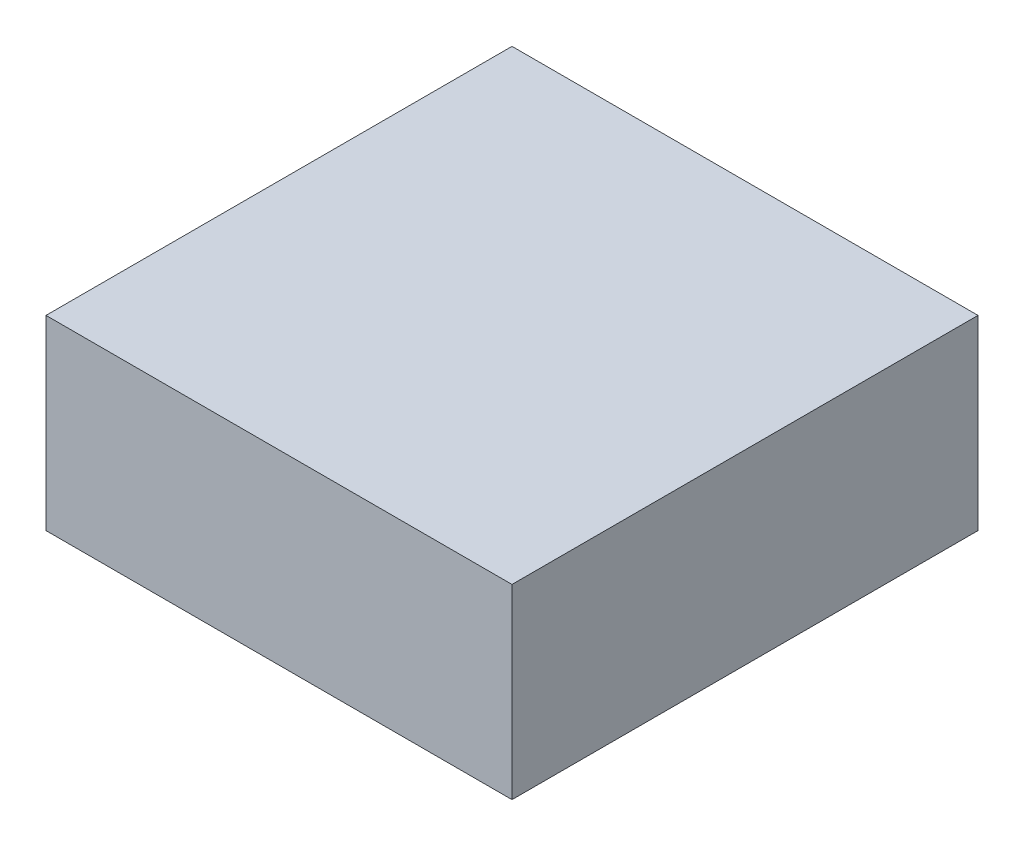
ISO-10303-21;
HEADER;
FILE_DESCRIPTION(('STEP AP214'),'2;1');
FILE_NAME('part.step','',(''),(''),'','','');
FILE_SCHEMA(('AUTOMOTIVE_DESIGN { 1 0 10303 214 1 1 1 1 }'));
ENDSEC;
DATA;
#1=APPLICATION_CONTEXT('core data for automotive mechanical design processes');
#2=APPLICATION_PROTOCOL_DEFINITION('international standard','automotive_design',2000,#1);
#3=PRODUCT_CONTEXT('',#1,'mechanical');
#4=PRODUCT('Part','Part','',(#3));
#5=PRODUCT_RELATED_PRODUCT_CATEGORY('part','',(#4));
#6=PRODUCT_DEFINITION_FORMATION('','',#4);
#7=PRODUCT_DEFINITION_CONTEXT('part definition',#1,'design');
#8=PRODUCT_DEFINITION('design','',#6,#7);
#9=PRODUCT_DEFINITION_SHAPE('','',#8);
#10=(LENGTH_UNIT() NAMED_UNIT(*) SI_UNIT(.MILLI.,.METRE.));
#11=(NAMED_UNIT(*) PLANE_ANGLE_UNIT() SI_UNIT($,.RADIAN.));
#12=(NAMED_UNIT(*) SI_UNIT($,.STERADIAN.) SOLID_ANGLE_UNIT());
#13=UNCERTAINTY_MEASURE_WITH_UNIT(LENGTH_MEASURE(1.E-05),#10,'distance_accuracy_value','');
#14=(GEOMETRIC_REPRESENTATION_CONTEXT(3) GLOBAL_UNCERTAINTY_ASSIGNED_CONTEXT((#13)) GLOBAL_UNIT_ASSIGNED_CONTEXT((#10,
#11,#12)) REPRESENTATION_CONTEXT('',''));
#15=CARTESIAN_POINT('',(0.,0.,0.));
#16=DIRECTION('',(0.,0.,1.));
#17=DIRECTION('',(1.,0.,0.));
#18=AXIS2_PLACEMENT_3D('',#15,#16,#17);
#19=CARTESIAN_POINT('',(10.,8.,10.));
#20=DIRECTION('',(-1.,0.,0.));
#21=DIRECTION('',(0.,0.,1.));
#22=AXIS2_PLACEMENT_3D('',#19,#20,#21);
#23=PLANE('',#22);
#24=DIRECTION('',(0.,0.,-1.));
#25=VECTOR('',#24,1.);
#26=CARTESIAN_POINT('',(10.,0.,10.));
#27=LINE('',#26,#25);
#28=CARTESIAN_POINT('',(10.,0.,10.));
#29=VERTEX_POINT('',#28);
#30=CARTESIAN_POINT('',(10.,0.,-10.));
#31=VERTEX_POINT('',#30);
#32=EDGE_CURVE('E96',#29,#31,#27,.T.);
#33=ORIENTED_EDGE('',*,*,#32,.T.);
#34=DIRECTION('',(0.,-1.,0.));
#35=VECTOR('',#34,1.);
#36=CARTESIAN_POINT('',(10.,8.,-10.));
#37=LINE('',#36,#35);
#38=CARTESIAN_POINT('',(10.,8.,-10.));
#39=VERTEX_POINT('',#38);
#40=EDGE_CURVE('E11',#39,#31,#37,.T.);
#41=ORIENTED_EDGE('',*,*,#40,.F.);
#42=DIRECTION('',(0.,0.,-1.));
#43=VECTOR('',#42,1.);
#44=CARTESIAN_POINT('',(10.,8.,10.));
#45=LINE('',#44,#43);
#46=CARTESIAN_POINT('',(10.,8.,10.));
#47=VERTEX_POINT('',#46);
#48=EDGE_CURVE('E84',#47,#39,#45,.T.);
#49=ORIENTED_EDGE('',*,*,#48,.F.);
#50=DIRECTION('',(0.,-1.,0.));
#51=VECTOR('',#50,1.);
#52=CARTESIAN_POINT('',(10.,8.,10.));
#53=LINE('',#52,#51);
#54=EDGE_CURVE('E92',#47,#29,#53,.T.);
#55=ORIENTED_EDGE('',*,*,#54,.T.);
#56=EDGE_LOOP('',(#33,#41,#49,#55));
#57=FACE_BOUND('',#56,.T.);
#58=ADVANCED_FACE('F33',(#57),#23,.F.);
#59=CARTESIAN_POINT('',(-10.,8.,-10.));
#60=DIRECTION('',(0.,0.,1.));
#61=DIRECTION('',(1.,0.,0.));
#62=AXIS2_PLACEMENT_3D('',#59,#60,#61);
#63=PLANE('',#62);
#64=DIRECTION('',(-1.,0.,0.));
#65=VECTOR('',#64,1.);
#66=CARTESIAN_POINT('',(-10.,0.,-10.));
#67=LINE('',#66,#65);
#68=CARTESIAN_POINT('',(-10.,0.,-10.));
#69=VERTEX_POINT('',#68);
#70=EDGE_CURVE('E88',#31,#69,#67,.T.);
#71=ORIENTED_EDGE('',*,*,#70,.T.);
#72=DIRECTION('',(0.,-1.,0.));
#73=VECTOR('',#72,1.);
#74=CARTESIAN_POINT('',(-10.,8.,-10.));
#75=LINE('',#74,#73);
#76=CARTESIAN_POINT('',(-10.,8.,-10.));
#77=VERTEX_POINT('',#76);
#78=EDGE_CURVE('E41',#77,#69,#75,.T.);
#79=ORIENTED_EDGE('',*,*,#78,.F.);
#80=DIRECTION('',(-1.,0.,0.));
#81=VECTOR('',#80,1.);
#82=CARTESIAN_POINT('',(-10.,8.,-10.));
#83=LINE('',#82,#81);
#84=EDGE_CURVE('E79',#39,#77,#83,.T.);
#85=ORIENTED_EDGE('',*,*,#84,.F.);
#86=ORIENTED_EDGE('',*,*,#40,.T.);
#87=EDGE_LOOP('',(#71,#79,#85,#86));
#88=FACE_BOUND('',#87,.T.);
#89=ADVANCED_FACE('F87',(#88),#63,.F.);
#90=CARTESIAN_POINT('',(-10.,8.,10.));
#91=DIRECTION('',(1.,0.,0.));
#92=DIRECTION('',(0.,0.,-1.));
#93=AXIS2_PLACEMENT_3D('',#90,#91,#92);
#94=PLANE('',#93);
#95=DIRECTION('',(0.,0.,1.));
#96=VECTOR('',#95,1.);
#97=CARTESIAN_POINT('',(-10.,0.,10.));
#98=LINE('',#97,#96);
#99=CARTESIAN_POINT('',(-10.,0.,10.));
#100=VERTEX_POINT('',#99);
#101=EDGE_CURVE('E66',#69,#100,#98,.T.);
#102=ORIENTED_EDGE('',*,*,#101,.T.);
#103=DIRECTION('',(0.,-1.,0.));
#104=VECTOR('',#103,1.);
#105=CARTESIAN_POINT('',(-10.,8.,10.));
#106=LINE('',#105,#104);
#107=CARTESIAN_POINT('',(-10.,8.,10.));
#108=VERTEX_POINT('',#107);
#109=EDGE_CURVE('E89',#108,#100,#106,.T.);
#110=ORIENTED_EDGE('',*,*,#109,.F.);
#111=DIRECTION('',(0.,0.,1.));
#112=VECTOR('',#111,1.);
#113=CARTESIAN_POINT('',(-10.,8.,10.));
#114=LINE('',#113,#112);
#115=EDGE_CURVE('E82',#77,#108,#114,.T.);
#116=ORIENTED_EDGE('',*,*,#115,.F.);
#117=ORIENTED_EDGE('',*,*,#78,.T.);
#118=EDGE_LOOP('',(#102,#110,#116,#117));
#119=FACE_BOUND('',#118,.T.);
#120=ADVANCED_FACE('F90',(#119),#94,.F.);
#121=CARTESIAN_POINT('',(-10.,8.,10.));
#122=DIRECTION('',(0.,0.,-1.));
#123=DIRECTION('',(-1.,0.,0.));
#124=AXIS2_PLACEMENT_3D('',#121,#122,#123);
#125=PLANE('',#124);
#126=DIRECTION('',(1.,0.,0.));
#127=VECTOR('',#126,1.);
#128=CARTESIAN_POINT('',(-10.,0.,10.));
#129=LINE('',#128,#127);
#130=EDGE_CURVE('E72',#100,#29,#129,.T.);
#131=ORIENTED_EDGE('',*,*,#130,.T.);
#132=ORIENTED_EDGE('',*,*,#54,.F.);
#133=DIRECTION('',(1.,0.,0.));
#134=VECTOR('',#133,1.);
#135=CARTESIAN_POINT('',(-10.,8.,10.));
#136=LINE('',#135,#134);
#137=EDGE_CURVE('E49',#108,#47,#136,.T.);
#138=ORIENTED_EDGE('',*,*,#137,.F.);
#139=ORIENTED_EDGE('',*,*,#109,.T.);
#140=EDGE_LOOP('',(#131,#132,#138,#139));
#141=FACE_BOUND('',#140,.T.);
#142=ADVANCED_FACE('F103',(#141),#125,.F.);
#143=CARTESIAN_POINT('',(0.,8.,0.));
#144=DIRECTION('',(0.,-1.,0.));
#145=DIRECTION('',(0.,0.,-1.));
#146=AXIS2_PLACEMENT_3D('',#143,#144,#145);
#147=PLANE('',#146);
#148=ORIENTED_EDGE('',*,*,#48,.T.);
#149=ORIENTED_EDGE('',*,*,#84,.T.);
#150=ORIENTED_EDGE('',*,*,#115,.T.);
#151=ORIENTED_EDGE('',*,*,#137,.T.);
#152=EDGE_LOOP('',(#148,#149,#150,#151));
#153=FACE_BOUND('',#152,.T.);
#154=ADVANCED_FACE('F80',(#153),#147,.F.);
#155=CARTESIAN_POINT('',(0.,0.,0.));
#156=DIRECTION('',(0.,-1.,0.));
#157=DIRECTION('',(0.,0.,-1.));
#158=AXIS2_PLACEMENT_3D('',#155,#156,#157);
#159=PLANE('',#158);
#160=ORIENTED_EDGE('',*,*,#32,.F.);
#161=ORIENTED_EDGE('',*,*,#130,.F.);
#162=ORIENTED_EDGE('',*,*,#101,.F.);
#163=ORIENTED_EDGE('',*,*,#70,.F.);
#164=EDGE_LOOP('',(#160,#161,#162,#163));
#165=FACE_BOUND('',#164,.T.);
#166=ADVANCED_FACE('F106',(#165),#159,.T.);
#167=CLOSED_SHELL('',(#58,#89,#120,#142,#154,#166));
#168=MANIFOLD_SOLID_BREP('B2',#167);
#169=ADVANCED_BREP_SHAPE_REPRESENTATION('',(#18,#168),#14);
#170=SHAPE_DEFINITION_REPRESENTATION(#9,#169);
ENDSEC;
END-ISO-10303-21;
